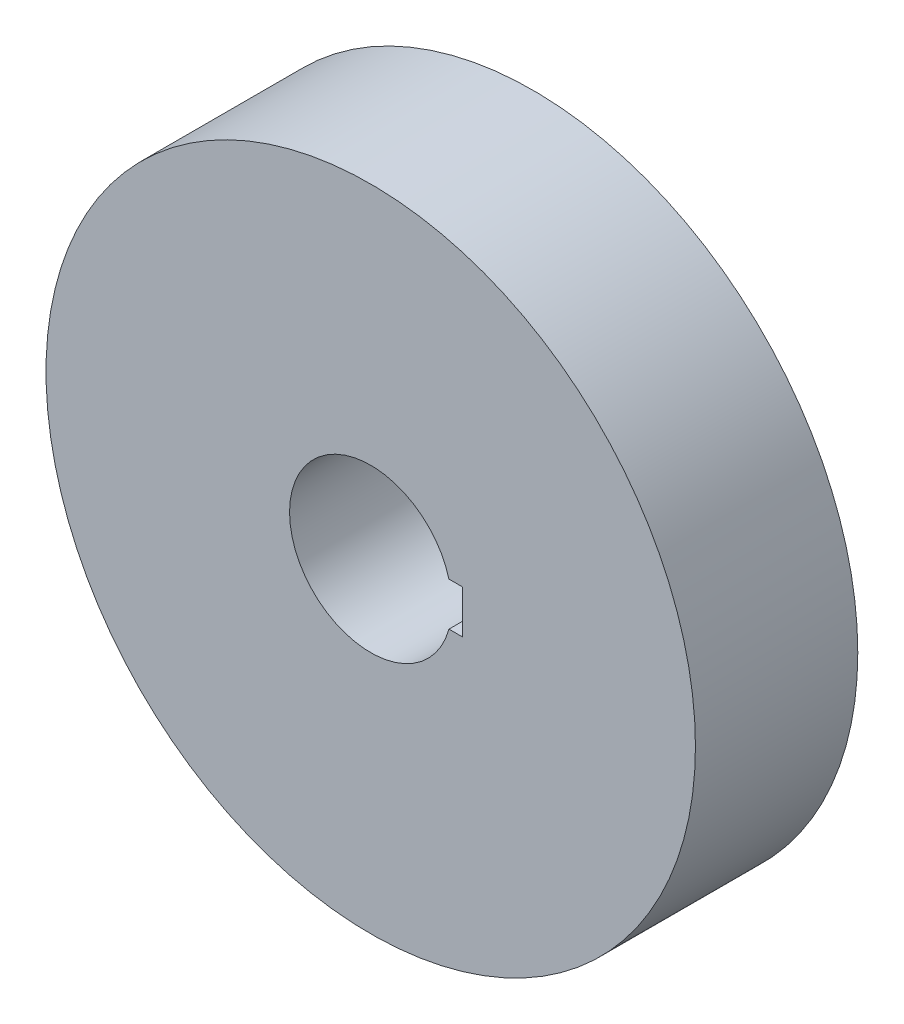
ISO-10303-21;
HEADER;
FILE_DESCRIPTION(('STEP AP214'),'2;1');
FILE_NAME('part.step','',(''),(''),'','','');
FILE_SCHEMA(('AUTOMOTIVE_DESIGN { 1 0 10303 214 1 1 1 1 }'));
ENDSEC;
DATA;
#1=APPLICATION_CONTEXT('core data for automotive mechanical design processes');
#2=APPLICATION_PROTOCOL_DEFINITION('international standard','automotive_design',2000,#1);
#3=PRODUCT_CONTEXT('',#1,'mechanical');
#4=PRODUCT('Part','Part','',(#3));
#5=PRODUCT_RELATED_PRODUCT_CATEGORY('part','',(#4));
#6=PRODUCT_DEFINITION_FORMATION('','',#4);
#7=PRODUCT_DEFINITION_CONTEXT('part definition',#1,'design');
#8=PRODUCT_DEFINITION('design','',#6,#7);
#9=PRODUCT_DEFINITION_SHAPE('','',#8);
#10=(LENGTH_UNIT() NAMED_UNIT(*) SI_UNIT(.MILLI.,.METRE.));
#11=(NAMED_UNIT(*) PLANE_ANGLE_UNIT() SI_UNIT($,.RADIAN.));
#12=(NAMED_UNIT(*) SI_UNIT($,.STERADIAN.) SOLID_ANGLE_UNIT());
#13=UNCERTAINTY_MEASURE_WITH_UNIT(LENGTH_MEASURE(1.E-05),#10,'distance_accuracy_value','');
#14=(GEOMETRIC_REPRESENTATION_CONTEXT(3) GLOBAL_UNCERTAINTY_ASSIGNED_CONTEXT((#13)) GLOBAL_UNIT_ASSIGNED_CONTEXT((#10,
#11,#12)) REPRESENTATION_CONTEXT('',''));
#15=CARTESIAN_POINT('',(0.,0.,0.));
#16=DIRECTION('',(0.,0.,1.));
#17=DIRECTION('',(1.,0.,0.));
#18=AXIS2_PLACEMENT_3D('',#15,#16,#17);
#19=CARTESIAN_POINT('',(0.,0.,7.5));
#20=DIRECTION('',(0.,0.,-1.));
#21=DIRECTION('',(-1.,0.,0.));
#22=AXIS2_PLACEMENT_3D('',#19,#20,#21);
#23=CYLINDRICAL_SURFACE('',#22,30.);
#24=CARTESIAN_POINT('',(0.,0.,7.5));
#25=DIRECTION('',(0.,0.,1.));
#26=DIRECTION('',(1.,0.,0.));
#27=AXIS2_PLACEMENT_3D('',#24,#25,#26);
#28=CIRCLE('',#27,30.);
#29=CARTESIAN_POINT('',(30.,0.,7.5));
#30=VERTEX_POINT('',#29);
#31=EDGE_CURVE('E116',#30,#30,#28,.T.);
#32=ORIENTED_EDGE('',*,*,#31,.F.);
#33=EDGE_LOOP('',(#32));
#34=FACE_BOUND('',#33,.T.);
#35=CARTESIAN_POINT('',(0.,0.,-7.5));
#36=DIRECTION('',(0.,0.,1.));
#37=DIRECTION('',(1.,0.,0.));
#38=AXIS2_PLACEMENT_3D('',#35,#36,#37);
#39=CIRCLE('',#38,30.);
#40=CARTESIAN_POINT('',(30.,0.,-7.5));
#41=VERTEX_POINT('',#40);
#42=EDGE_CURVE('E111',#41,#41,#39,.T.);
#43=ORIENTED_EDGE('',*,*,#42,.T.);
#44=EDGE_LOOP('',(#43));
#45=FACE_BOUND('',#44,.T.);
#46=ADVANCED_FACE('F39',(#34,#45),#23,.T.);
#47=CARTESIAN_POINT('',(0.,0.,7.5));
#48=DIRECTION('',(0.,0.,1.));
#49=DIRECTION('',(1.,0.,0.));
#50=AXIS2_PLACEMENT_3D('',#47,#48,#49);
#51=PLANE('',#50);
#52=CARTESIAN_POINT('',(0.,0.,7.5));
#53=DIRECTION('',(0.,0.,1.));
#54=DIRECTION('',(1.,0.,0.));
#55=AXIS2_PLACEMENT_3D('',#52,#53,#54);
#56=CIRCLE('',#55,7.5);
#57=CARTESIAN_POINT('',(7.22841614740048,2.,7.5));
#58=VERTEX_POINT('',#57);
#59=CARTESIAN_POINT('',(7.22841614740048,-2.,7.5));
#60=VERTEX_POINT('',#59);
#61=EDGE_CURVE('E54',#58,#60,#56,.T.);
#62=ORIENTED_EDGE('',*,*,#61,.F.);
#63=DIRECTION('',(-1.,0.,0.));
#64=VECTOR('',#63,1.);
#65=CARTESIAN_POINT('',(7.22841614740048,2.,7.5));
#66=LINE('',#65,#64);
#67=CARTESIAN_POINT('',(8.5,2.,7.5));
#68=VERTEX_POINT('',#67);
#69=EDGE_CURVE('E101',#68,#58,#66,.T.);
#70=ORIENTED_EDGE('',*,*,#69,.F.);
#71=DIRECTION('',(0.,1.,0.));
#72=VECTOR('',#71,1.);
#73=CARTESIAN_POINT('',(8.5,2.,7.5));
#74=LINE('',#73,#72);
#75=CARTESIAN_POINT('',(8.5,-2.,7.5));
#76=VERTEX_POINT('',#75);
#77=EDGE_CURVE('E83',#76,#68,#74,.T.);
#78=ORIENTED_EDGE('',*,*,#77,.F.);
#79=DIRECTION('',(1.,0.,0.));
#80=VECTOR('',#79,1.);
#81=CARTESIAN_POINT('',(7.22841614740048,-2.,7.5));
#82=LINE('',#81,#80);
#83=EDGE_CURVE('E93',#60,#76,#82,.T.);
#84=ORIENTED_EDGE('',*,*,#83,.F.);
#85=EDGE_LOOP('',(#62,#70,#78,#84));
#86=FACE_BOUND('',#85,.T.);
#87=ORIENTED_EDGE('',*,*,#31,.T.);
#88=EDGE_LOOP('',(#87));
#89=FACE_BOUND('',#88,.T.);
#90=ADVANCED_FACE('F98',(#86,#89),#51,.T.);
#91=CARTESIAN_POINT('',(0.,0.,-7.5));
#92=DIRECTION('',(0.,0.,1.));
#93=DIRECTION('',(1.,0.,0.));
#94=AXIS2_PLACEMENT_3D('',#91,#92,#93);
#95=PLANE('',#94);
#96=DIRECTION('',(-1.,0.,0.));
#97=VECTOR('',#96,1.);
#98=CARTESIAN_POINT('',(0.,2.,-7.5));
#99=LINE('',#98,#97);
#100=CARTESIAN_POINT('',(8.5,2.,-7.5));
#101=VERTEX_POINT('',#100);
#102=CARTESIAN_POINT('',(7.22841614740048,2.,-7.5));
#103=VERTEX_POINT('',#102);
#104=EDGE_CURVE('E47',#101,#103,#99,.T.);
#105=ORIENTED_EDGE('',*,*,#104,.T.);
#106=CARTESIAN_POINT('',(0.,0.,-7.5));
#107=DIRECTION('',(0.,0.,1.));
#108=DIRECTION('',(1.,0.,0.));
#109=AXIS2_PLACEMENT_3D('',#106,#107,#108);
#110=CIRCLE('',#109,7.5);
#111=CARTESIAN_POINT('',(7.22841614740048,-2.,-7.5));
#112=VERTEX_POINT('',#111);
#113=EDGE_CURVE('E11',#103,#112,#110,.T.);
#114=ORIENTED_EDGE('',*,*,#113,.T.);
#115=DIRECTION('',(1.,0.,0.));
#116=VECTOR('',#115,1.);
#117=CARTESIAN_POINT('',(0.,-2.,-7.5));
#118=LINE('',#117,#116);
#119=CARTESIAN_POINT('',(8.5,-2.,-7.5));
#120=VERTEX_POINT('',#119);
#121=EDGE_CURVE('E120',#112,#120,#118,.T.);
#122=ORIENTED_EDGE('',*,*,#121,.T.);
#123=DIRECTION('',(0.,1.,0.));
#124=VECTOR('',#123,1.);
#125=CARTESIAN_POINT('',(8.5,0.,-7.5));
#126=LINE('',#125,#124);
#127=EDGE_CURVE('E86',#120,#101,#126,.T.);
#128=ORIENTED_EDGE('',*,*,#127,.T.);
#129=EDGE_LOOP('',(#105,#114,#122,#128));
#130=FACE_BOUND('',#129,.T.);
#131=ORIENTED_EDGE('',*,*,#42,.F.);
#132=EDGE_LOOP('',(#131));
#133=FACE_BOUND('',#132,.T.);
#134=ADVANCED_FACE('F130',(#130,#133),#95,.F.);
#135=CARTESIAN_POINT('',(0.,0.,-22.5));
#136=DIRECTION('',(0.,0.,1.));
#137=DIRECTION('',(1.,0.,0.));
#138=AXIS2_PLACEMENT_3D('',#135,#136,#137);
#139=CYLINDRICAL_SURFACE('',#138,7.5);
#140=DIRECTION('',(0.,0.,1.));
#141=VECTOR('',#140,1.);
#142=CARTESIAN_POINT('',(7.22841614740048,2.,-22.5));
#143=LINE('',#142,#141);
#144=EDGE_CURVE('E108',#103,#58,#143,.T.);
#145=ORIENTED_EDGE('',*,*,#144,.T.);
#146=ORIENTED_EDGE('',*,*,#61,.T.);
#147=DIRECTION('',(0.,0.,1.));
#148=VECTOR('',#147,1.);
#149=CARTESIAN_POINT('',(7.22841614740048,-2.,-22.5));
#150=LINE('',#149,#148);
#151=EDGE_CURVE('E90',#112,#60,#150,.T.);
#152=ORIENTED_EDGE('',*,*,#151,.F.);
#153=ORIENTED_EDGE('',*,*,#113,.F.);
#154=EDGE_LOOP('',(#145,#146,#152,#153));
#155=FACE_BOUND('',#154,.T.);
#156=ADVANCED_FACE('F135',(#155),#139,.F.);
#157=CARTESIAN_POINT('',(7.22841614740048,2.,-22.5));
#158=DIRECTION('',(0.,1.,0.));
#159=DIRECTION('',(0.,0.,1.));
#160=AXIS2_PLACEMENT_3D('',#157,#158,#159);
#161=PLANE('',#160);
#162=DIRECTION('',(0.,0.,1.));
#163=VECTOR('',#162,1.);
#164=CARTESIAN_POINT('',(8.5,2.,-22.5));
#165=LINE('',#164,#163);
#166=EDGE_CURVE('E89',#101,#68,#165,.T.);
#167=ORIENTED_EDGE('',*,*,#166,.T.);
#168=ORIENTED_EDGE('',*,*,#69,.T.);
#169=ORIENTED_EDGE('',*,*,#144,.F.);
#170=ORIENTED_EDGE('',*,*,#104,.F.);
#171=EDGE_LOOP('',(#167,#168,#169,#170));
#172=FACE_BOUND('',#171,.T.);
#173=ADVANCED_FACE('F134',(#172),#161,.F.);
#174=CARTESIAN_POINT('',(8.5,2.,-22.5));
#175=DIRECTION('',(1.,0.,0.));
#176=DIRECTION('',(0.,0.,-1.));
#177=AXIS2_PLACEMENT_3D('',#174,#175,#176);
#178=PLANE('',#177);
#179=DIRECTION('',(0.,0.,1.));
#180=VECTOR('',#179,1.);
#181=CARTESIAN_POINT('',(8.5,-2.,-22.5));
#182=LINE('',#181,#180);
#183=EDGE_CURVE('E62',#120,#76,#182,.T.);
#184=ORIENTED_EDGE('',*,*,#183,.T.);
#185=ORIENTED_EDGE('',*,*,#77,.T.);
#186=ORIENTED_EDGE('',*,*,#166,.F.);
#187=ORIENTED_EDGE('',*,*,#127,.F.);
#188=EDGE_LOOP('',(#184,#185,#186,#187));
#189=FACE_BOUND('',#188,.T.);
#190=ADVANCED_FACE('F80',(#189),#178,.F.);
#191=CARTESIAN_POINT('',(7.22841614740048,-2.,-22.5));
#192=DIRECTION('',(0.,-1.,0.));
#193=DIRECTION('',(0.,0.,-1.));
#194=AXIS2_PLACEMENT_3D('',#191,#192,#193);
#195=PLANE('',#194);
#196=ORIENTED_EDGE('',*,*,#151,.T.);
#197=ORIENTED_EDGE('',*,*,#83,.T.);
#198=ORIENTED_EDGE('',*,*,#183,.F.);
#199=ORIENTED_EDGE('',*,*,#121,.F.);
#200=EDGE_LOOP('',(#196,#197,#198,#199));
#201=FACE_BOUND('',#200,.T.);
#202=ADVANCED_FACE('F94',(#201),#195,.F.);
#203=CLOSED_SHELL('',(#46,#90,#134,#156,#173,#190,#202));
#204=MANIFOLD_SOLID_BREP('B2',#203);
#205=ADVANCED_BREP_SHAPE_REPRESENTATION('',(#18,#204),#14);
#206=SHAPE_DEFINITION_REPRESENTATION(#9,#205);
ENDSEC;
END-ISO-10303-21;
